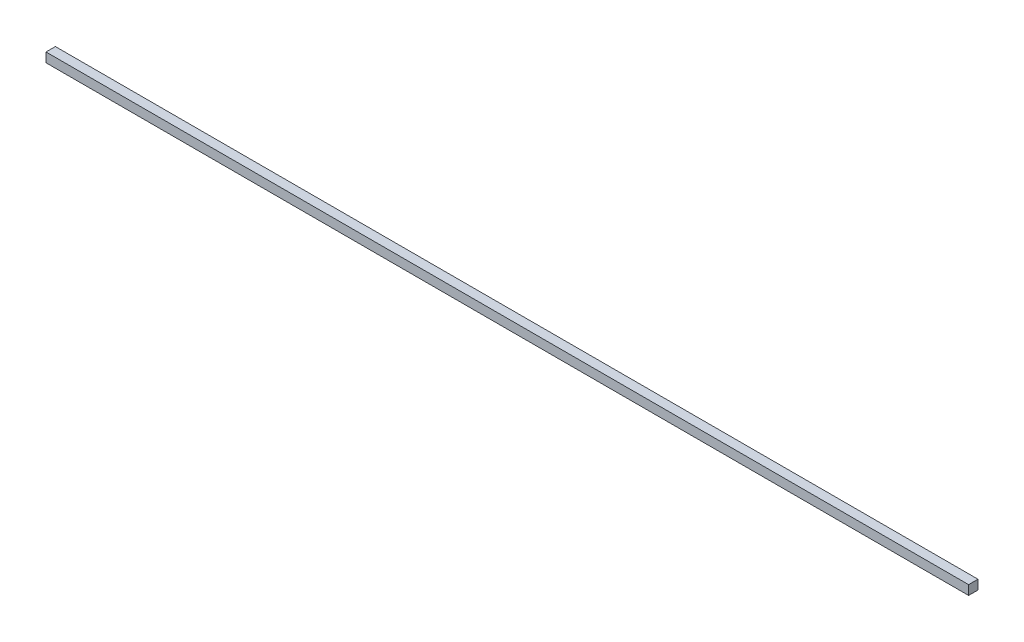
ISO-10303-21;
HEADER;
FILE_DESCRIPTION(('STEP AP214'),'2;1');
FILE_NAME('part.step','',(''),(''),'','','');
FILE_SCHEMA(('AUTOMOTIVE_DESIGN { 1 0 10303 214 1 1 1 1 }'));
ENDSEC;
DATA;
#1=APPLICATION_CONTEXT('core data for automotive mechanical design processes');
#2=APPLICATION_PROTOCOL_DEFINITION('international standard','automotive_design',2000,#1);
#3=PRODUCT_CONTEXT('',#1,'mechanical');
#4=PRODUCT('Part','Part','',(#3));
#5=PRODUCT_RELATED_PRODUCT_CATEGORY('part','',(#4));
#6=PRODUCT_DEFINITION_FORMATION('','',#4);
#7=PRODUCT_DEFINITION_CONTEXT('part definition',#1,'design');
#8=PRODUCT_DEFINITION('design','',#6,#7);
#9=PRODUCT_DEFINITION_SHAPE('','',#8);
#10=(LENGTH_UNIT() NAMED_UNIT(*) SI_UNIT(.MILLI.,.METRE.));
#11=(NAMED_UNIT(*) PLANE_ANGLE_UNIT() SI_UNIT($,.RADIAN.));
#12=(NAMED_UNIT(*) SI_UNIT($,.STERADIAN.) SOLID_ANGLE_UNIT());
#13=UNCERTAINTY_MEASURE_WITH_UNIT(LENGTH_MEASURE(1.E-05),#10,'distance_accuracy_value','');
#14=(GEOMETRIC_REPRESENTATION_CONTEXT(3) GLOBAL_UNCERTAINTY_ASSIGNED_CONTEXT((#13)) GLOBAL_UNIT_ASSIGNED_CONTEXT((#10,
#11,#12)) REPRESENTATION_CONTEXT('',''));
#15=CARTESIAN_POINT('',(0.,0.,0.));
#16=DIRECTION('',(0.,0.,1.));
#17=DIRECTION('',(1.,0.,0.));
#18=AXIS2_PLACEMENT_3D('',#15,#16,#17);
#19=CARTESIAN_POINT('',(312.1,1.5875,1.5875));
#20=DIRECTION('',(0.,0.,-1.));
#21=DIRECTION('',(0.,-1.,0.));
#22=AXIS2_PLACEMENT_3D('',#19,#20,#21);
#23=PLANE('',#22);
#24=DIRECTION('',(0.,1.,0.));
#25=VECTOR('',#24,1.);
#26=CARTESIAN_POINT('',(0.,1.5875,1.5875));
#27=LINE('',#26,#25);
#28=CARTESIAN_POINT('',(0.,-1.5875,1.5875));
#29=VERTEX_POINT('',#28);
#30=CARTESIAN_POINT('',(0.,1.5875,1.5875));
#31=VERTEX_POINT('',#30);
#32=EDGE_CURVE('E102',#29,#31,#27,.T.);
#33=ORIENTED_EDGE('',*,*,#32,.F.);
#34=DIRECTION('',(-1.,0.,0.));
#35=VECTOR('',#34,1.);
#36=CARTESIAN_POINT('',(312.1,-1.5875,1.5875));
#37=LINE('',#36,#35);
#38=CARTESIAN_POINT('',(312.1,-1.5875,1.5875));
#39=VERTEX_POINT('',#38);
#40=EDGE_CURVE('E103',#39,#29,#37,.T.);
#41=ORIENTED_EDGE('',*,*,#40,.F.);
#42=DIRECTION('',(0.,1.,0.));
#43=VECTOR('',#42,1.);
#44=CARTESIAN_POINT('',(312.1,1.5875,1.5875));
#45=LINE('',#44,#43);
#46=CARTESIAN_POINT('',(312.1,1.5875,1.5875));
#47=VERTEX_POINT('',#46);
#48=EDGE_CURVE('E98',#39,#47,#45,.T.);
#49=ORIENTED_EDGE('',*,*,#48,.T.);
#50=DIRECTION('',(-1.,0.,0.));
#51=VECTOR('',#50,1.);
#52=CARTESIAN_POINT('',(312.1,1.5875,1.5875));
#53=LINE('',#52,#51);
#54=EDGE_CURVE('E11',#47,#31,#53,.T.);
#55=ORIENTED_EDGE('',*,*,#54,.T.);
#56=EDGE_LOOP('',(#33,#41,#49,#55));
#57=FACE_BOUND('',#56,.T.);
#58=ADVANCED_FACE('F41',(#57),#23,.F.);
#59=CARTESIAN_POINT('',(312.1,1.5875,-1.5875));
#60=DIRECTION('',(0.,-1.,0.));
#61=DIRECTION('',(0.,0.,1.));
#62=AXIS2_PLACEMENT_3D('',#59,#60,#61);
#63=PLANE('',#62);
#64=DIRECTION('',(0.,0.,-1.));
#65=VECTOR('',#64,1.);
#66=CARTESIAN_POINT('',(0.,1.5875,-1.5875));
#67=LINE('',#66,#65);
#68=CARTESIAN_POINT('',(0.,1.5875,-1.5875));
#69=VERTEX_POINT('',#68);
#70=EDGE_CURVE('E106',#31,#69,#67,.T.);
#71=ORIENTED_EDGE('',*,*,#70,.F.);
#72=ORIENTED_EDGE('',*,*,#54,.F.);
#73=DIRECTION('',(0.,0.,-1.));
#74=VECTOR('',#73,1.);
#75=CARTESIAN_POINT('',(312.1,1.5875,-1.5875));
#76=LINE('',#75,#74);
#77=CARTESIAN_POINT('',(312.1,1.5875,-1.5875));
#78=VERTEX_POINT('',#77);
#79=EDGE_CURVE('E85',#47,#78,#76,.T.);
#80=ORIENTED_EDGE('',*,*,#79,.T.);
#81=DIRECTION('',(-1.,0.,0.));
#82=VECTOR('',#81,1.);
#83=CARTESIAN_POINT('',(312.1,1.5875,-1.5875));
#84=LINE('',#83,#82);
#85=EDGE_CURVE('E47',#78,#69,#84,.T.);
#86=ORIENTED_EDGE('',*,*,#85,.T.);
#87=EDGE_LOOP('',(#71,#72,#80,#86));
#88=FACE_BOUND('',#87,.T.);
#89=ADVANCED_FACE('F96',(#88),#63,.F.);
#90=CARTESIAN_POINT('',(312.1,1.5875,-1.5875));
#91=DIRECTION('',(0.,0.,1.));
#92=DIRECTION('',(0.,1.,0.));
#93=AXIS2_PLACEMENT_3D('',#90,#91,#92);
#94=PLANE('',#93);
#95=DIRECTION('',(0.,-1.,0.));
#96=VECTOR('',#95,1.);
#97=CARTESIAN_POINT('',(0.,1.5875,-1.5875));
#98=LINE('',#97,#96);
#99=CARTESIAN_POINT('',(0.,-1.5875,-1.5875));
#100=VERTEX_POINT('',#99);
#101=EDGE_CURVE('E95',#69,#100,#98,.T.);
#102=ORIENTED_EDGE('',*,*,#101,.F.);
#103=ORIENTED_EDGE('',*,*,#85,.F.);
#104=DIRECTION('',(0.,-1.,0.));
#105=VECTOR('',#104,1.);
#106=CARTESIAN_POINT('',(312.1,1.5875,-1.5875));
#107=LINE('',#106,#105);
#108=CARTESIAN_POINT('',(312.1,-1.5875,-1.5875));
#109=VERTEX_POINT('',#108);
#110=EDGE_CURVE('E83',#78,#109,#107,.T.);
#111=ORIENTED_EDGE('',*,*,#110,.T.);
#112=DIRECTION('',(-1.,0.,0.));
#113=VECTOR('',#112,1.);
#114=CARTESIAN_POINT('',(312.1,-1.5875,-1.5875));
#115=LINE('',#114,#113);
#116=EDGE_CURVE('E92',#109,#100,#115,.T.);
#117=ORIENTED_EDGE('',*,*,#116,.T.);
#118=EDGE_LOOP('',(#102,#103,#111,#117));
#119=FACE_BOUND('',#118,.T.);
#120=ADVANCED_FACE('F93',(#119),#94,.F.);
#121=CARTESIAN_POINT('',(312.1,-1.5875,-1.5875));
#122=DIRECTION('',(0.,1.,0.));
#123=DIRECTION('',(0.,0.,-1.));
#124=AXIS2_PLACEMENT_3D('',#121,#122,#123);
#125=PLANE('',#124);
#126=DIRECTION('',(0.,0.,1.));
#127=VECTOR('',#126,1.);
#128=CARTESIAN_POINT('',(0.,-1.5875,-1.5875));
#129=LINE('',#128,#127);
#130=EDGE_CURVE('E72',#100,#29,#129,.T.);
#131=ORIENTED_EDGE('',*,*,#130,.F.);
#132=ORIENTED_EDGE('',*,*,#116,.F.);
#133=DIRECTION('',(0.,0.,1.));
#134=VECTOR('',#133,1.);
#135=CARTESIAN_POINT('',(312.1,-1.5875,-1.5875));
#136=LINE('',#135,#134);
#137=EDGE_CURVE('E60',#109,#39,#136,.T.);
#138=ORIENTED_EDGE('',*,*,#137,.T.);
#139=ORIENTED_EDGE('',*,*,#40,.T.);
#140=EDGE_LOOP('',(#131,#132,#138,#139));
#141=FACE_BOUND('',#140,.T.);
#142=ADVANCED_FACE('F113',(#141),#125,.F.);
#143=CARTESIAN_POINT('',(312.1,0.,0.));
#144=DIRECTION('',(1.,0.,0.));
#145=DIRECTION('',(0.,0.,1.));
#146=AXIS2_PLACEMENT_3D('',#143,#144,#145);
#147=PLANE('',#146);
#148=ORIENTED_EDGE('',*,*,#48,.F.);
#149=ORIENTED_EDGE('',*,*,#137,.F.);
#150=ORIENTED_EDGE('',*,*,#110,.F.);
#151=ORIENTED_EDGE('',*,*,#79,.F.);
#152=EDGE_LOOP('',(#148,#149,#150,#151));
#153=FACE_BOUND('',#152,.T.);
#154=ADVANCED_FACE('F87',(#153),#147,.T.);
#155=CARTESIAN_POINT('',(0.,0.,0.));
#156=DIRECTION('',(1.,0.,0.));
#157=DIRECTION('',(0.,0.,1.));
#158=AXIS2_PLACEMENT_3D('',#155,#156,#157);
#159=PLANE('',#158);
#160=ORIENTED_EDGE('',*,*,#32,.T.);
#161=ORIENTED_EDGE('',*,*,#70,.T.);
#162=ORIENTED_EDGE('',*,*,#101,.T.);
#163=ORIENTED_EDGE('',*,*,#130,.T.);
#164=EDGE_LOOP('',(#160,#161,#162,#163));
#165=FACE_BOUND('',#164,.T.);
#166=ADVANCED_FACE('F112',(#165),#159,.F.);
#167=CLOSED_SHELL('',(#58,#89,#120,#142,#154,#166));
#168=MANIFOLD_SOLID_BREP('B2',#167);
#169=ADVANCED_BREP_SHAPE_REPRESENTATION('',(#18,#168),#14);
#170=SHAPE_DEFINITION_REPRESENTATION(#9,#169);
ENDSEC;
END-ISO-10303-21;
